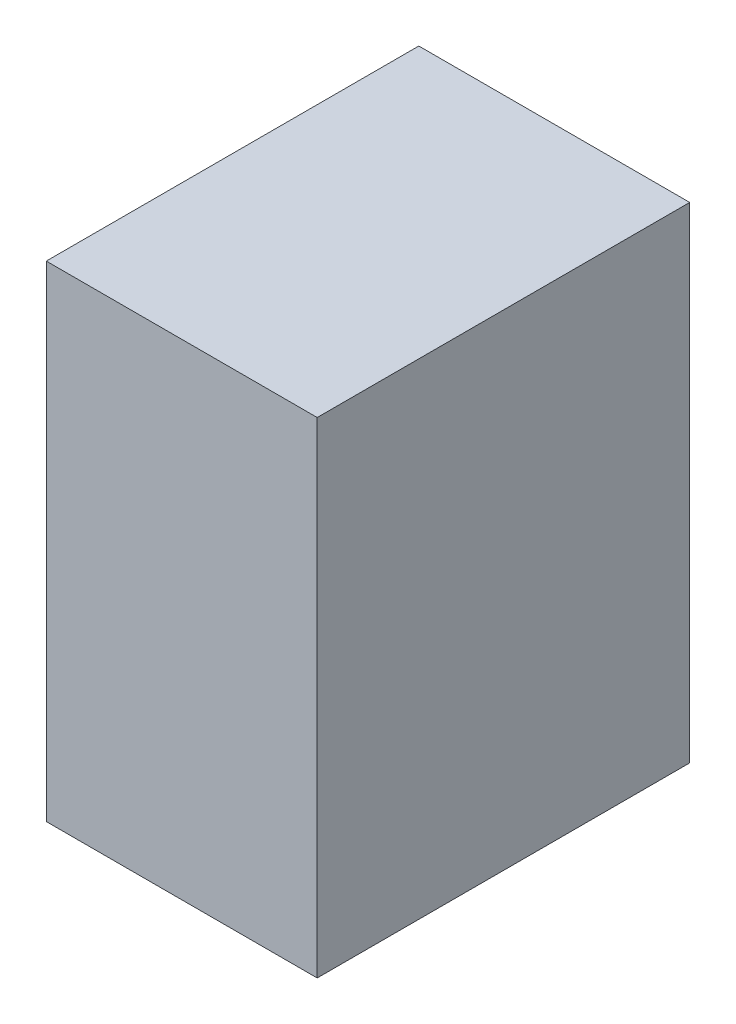
ISO-10303-21;
HEADER;
FILE_DESCRIPTION(('STEP AP214'),'2;1');
FILE_NAME('part.step','',(''),(''),'','','');
FILE_SCHEMA(('AUTOMOTIVE_DESIGN { 1 0 10303 214 1 1 1 1 }'));
ENDSEC;
DATA;
#1=APPLICATION_CONTEXT('core data for automotive mechanical design processes');
#2=APPLICATION_PROTOCOL_DEFINITION('international standard','automotive_design',2000,#1);
#3=PRODUCT_CONTEXT('',#1,'mechanical');
#4=PRODUCT('Part','Part','',(#3));
#5=PRODUCT_RELATED_PRODUCT_CATEGORY('part','',(#4));
#6=PRODUCT_DEFINITION_FORMATION('','',#4);
#7=PRODUCT_DEFINITION_CONTEXT('part definition',#1,'design');
#8=PRODUCT_DEFINITION('design','',#6,#7);
#9=PRODUCT_DEFINITION_SHAPE('','',#8);
#10=(LENGTH_UNIT() NAMED_UNIT(*) SI_UNIT(.MILLI.,.METRE.));
#11=(NAMED_UNIT(*) PLANE_ANGLE_UNIT() SI_UNIT($,.RADIAN.));
#12=(NAMED_UNIT(*) SI_UNIT($,.STERADIAN.) SOLID_ANGLE_UNIT());
#13=UNCERTAINTY_MEASURE_WITH_UNIT(LENGTH_MEASURE(1.E-05),#10,'distance_accuracy_value','');
#14=(GEOMETRIC_REPRESENTATION_CONTEXT(3) GLOBAL_UNCERTAINTY_ASSIGNED_CONTEXT((#13)) GLOBAL_UNIT_ASSIGNED_CONTEXT((#10,
#11,#12)) REPRESENTATION_CONTEXT('',''));
#15=CARTESIAN_POINT('',(0.,0.,0.));
#16=DIRECTION('',(0.,0.,1.));
#17=DIRECTION('',(1.,0.,0.));
#18=AXIS2_PLACEMENT_3D('',#15,#16,#17);
#19=CARTESIAN_POINT('',(-24.,-41.5,78.5));
#20=DIRECTION('',(0.,-1.,0.));
#21=DIRECTION('',(0.,0.,-1.));
#22=AXIS2_PLACEMENT_3D('',#19,#20,#21);
#23=PLANE('',#22);
#24=DIRECTION('',(0.,0.,-1.));
#25=VECTOR('',#24,1.);
#26=CARTESIAN_POINT('',(0.,-41.5,78.5));
#27=LINE('',#26,#25);
#28=CARTESIAN_POINT('',(0.,-41.5,78.5));
#29=VERTEX_POINT('',#28);
#30=CARTESIAN_POINT('',(0.,-41.5,45.5));
#31=VERTEX_POINT('',#30);
#32=EDGE_CURVE('E104',#29,#31,#27,.T.);
#33=ORIENTED_EDGE('',*,*,#32,.F.);
#34=DIRECTION('',(1.,0.,0.));
#35=VECTOR('',#34,1.);
#36=CARTESIAN_POINT('',(-24.,-41.5,78.5));
#37=LINE('',#36,#35);
#38=CARTESIAN_POINT('',(-24.,-41.5,78.5));
#39=VERTEX_POINT('',#38);
#40=EDGE_CURVE('E11',#39,#29,#37,.T.);
#41=ORIENTED_EDGE('',*,*,#40,.F.);
#42=DIRECTION('',(0.,0.,-1.));
#43=VECTOR('',#42,1.);
#44=CARTESIAN_POINT('',(-24.,-41.5,78.5));
#45=LINE('',#44,#43);
#46=CARTESIAN_POINT('',(-24.,-41.5,45.5));
#47=VERTEX_POINT('',#46);
#48=EDGE_CURVE('E97',#39,#47,#45,.T.);
#49=ORIENTED_EDGE('',*,*,#48,.T.);
#50=DIRECTION('',(1.,0.,0.));
#51=VECTOR('',#50,1.);
#52=CARTESIAN_POINT('',(-24.,-41.5,45.5));
#53=LINE('',#52,#51);
#54=EDGE_CURVE('E42',#47,#31,#53,.T.);
#55=ORIENTED_EDGE('',*,*,#54,.T.);
#56=EDGE_LOOP('',(#33,#41,#49,#55));
#57=FACE_BOUND('',#56,.T.);
#58=ADVANCED_FACE('F41',(#57),#23,.T.);
#59=CARTESIAN_POINT('',(-24.,1.5,78.5));
#60=DIRECTION('',(0.,0.,1.));
#61=DIRECTION('',(1.,0.,0.));
#62=AXIS2_PLACEMENT_3D('',#59,#60,#61);
#63=PLANE('',#62);
#64=DIRECTION('',(0.,-1.,0.));
#65=VECTOR('',#64,1.);
#66=CARTESIAN_POINT('',(0.,1.5,78.5));
#67=LINE('',#66,#65);
#68=CARTESIAN_POINT('',(0.,1.5,78.5));
#69=VERTEX_POINT('',#68);
#70=EDGE_CURVE('E101',#69,#29,#67,.T.);
#71=ORIENTED_EDGE('',*,*,#70,.F.);
#72=DIRECTION('',(1.,0.,0.));
#73=VECTOR('',#72,1.);
#74=CARTESIAN_POINT('',(-24.,1.5,78.5));
#75=LINE('',#74,#73);
#76=CARTESIAN_POINT('',(-24.,1.5,78.5));
#77=VERTEX_POINT('',#76);
#78=EDGE_CURVE('E49',#77,#69,#75,.T.);
#79=ORIENTED_EDGE('',*,*,#78,.F.);
#80=DIRECTION('',(0.,-1.,0.));
#81=VECTOR('',#80,1.);
#82=CARTESIAN_POINT('',(-24.,1.5,78.5));
#83=LINE('',#82,#81);
#84=EDGE_CURVE('E96',#77,#39,#83,.T.);
#85=ORIENTED_EDGE('',*,*,#84,.T.);
#86=ORIENTED_EDGE('',*,*,#40,.T.);
#87=EDGE_LOOP('',(#71,#79,#85,#86));
#88=FACE_BOUND('',#87,.T.);
#89=ADVANCED_FACE('F113',(#88),#63,.T.);
#90=CARTESIAN_POINT('',(-24.,1.5,45.5));
#91=DIRECTION('',(0.,1.,0.));
#92=DIRECTION('',(0.,0.,1.));
#93=AXIS2_PLACEMENT_3D('',#90,#91,#92);
#94=PLANE('',#93);
#95=DIRECTION('',(0.,0.,1.));
#96=VECTOR('',#95,1.);
#97=CARTESIAN_POINT('',(0.,1.5,45.5));
#98=LINE('',#97,#96);
#99=CARTESIAN_POINT('',(0.,1.5,45.5));
#100=VERTEX_POINT('',#99);
#101=EDGE_CURVE('E93',#100,#69,#98,.T.);
#102=ORIENTED_EDGE('',*,*,#101,.F.);
#103=DIRECTION('',(1.,0.,0.));
#104=VECTOR('',#103,1.);
#105=CARTESIAN_POINT('',(-24.,1.5,45.5));
#106=LINE('',#105,#104);
#107=CARTESIAN_POINT('',(-24.,1.5,45.5));
#108=VERTEX_POINT('',#107);
#109=EDGE_CURVE('E88',#108,#100,#106,.T.);
#110=ORIENTED_EDGE('',*,*,#109,.F.);
#111=DIRECTION('',(0.,0.,1.));
#112=VECTOR('',#111,1.);
#113=CARTESIAN_POINT('',(-24.,1.5,45.5));
#114=LINE('',#113,#112);
#115=EDGE_CURVE('E90',#108,#77,#114,.T.);
#116=ORIENTED_EDGE('',*,*,#115,.T.);
#117=ORIENTED_EDGE('',*,*,#78,.T.);
#118=EDGE_LOOP('',(#102,#110,#116,#117));
#119=FACE_BOUND('',#118,.T.);
#120=ADVANCED_FACE('F86',(#119),#94,.T.);
#121=CARTESIAN_POINT('',(-24.,-41.5,45.5));
#122=DIRECTION('',(0.,0.,-1.));
#123=DIRECTION('',(-1.,0.,0.));
#124=AXIS2_PLACEMENT_3D('',#121,#122,#123);
#125=PLANE('',#124);
#126=DIRECTION('',(0.,1.,0.));
#127=VECTOR('',#126,1.);
#128=CARTESIAN_POINT('',(0.,-41.5,45.5));
#129=LINE('',#128,#127);
#130=EDGE_CURVE('E107',#31,#100,#129,.T.);
#131=ORIENTED_EDGE('',*,*,#130,.F.);
#132=ORIENTED_EDGE('',*,*,#54,.F.);
#133=DIRECTION('',(0.,1.,0.));
#134=VECTOR('',#133,1.);
#135=CARTESIAN_POINT('',(-24.,-41.5,45.5));
#136=LINE('',#135,#134);
#137=EDGE_CURVE('E92',#47,#108,#136,.T.);
#138=ORIENTED_EDGE('',*,*,#137,.T.);
#139=ORIENTED_EDGE('',*,*,#109,.T.);
#140=EDGE_LOOP('',(#131,#132,#138,#139));
#141=FACE_BOUND('',#140,.T.);
#142=ADVANCED_FACE('F98',(#141),#125,.T.);
#143=CARTESIAN_POINT('',(-24.,0.,0.));
#144=DIRECTION('',(1.,0.,0.));
#145=DIRECTION('',(0.,0.,-1.));
#146=AXIS2_PLACEMENT_3D('',#143,#144,#145);
#147=PLANE('',#146);
#148=ORIENTED_EDGE('',*,*,#48,.F.);
#149=ORIENTED_EDGE('',*,*,#84,.F.);
#150=ORIENTED_EDGE('',*,*,#115,.F.);
#151=ORIENTED_EDGE('',*,*,#137,.F.);
#152=EDGE_LOOP('',(#148,#149,#150,#151));
#153=FACE_BOUND('',#152,.T.);
#154=ADVANCED_FACE('F94',(#153),#147,.F.);
#155=CARTESIAN_POINT('',(0.,0.,0.));
#156=DIRECTION('',(1.,0.,0.));
#157=DIRECTION('',(0.,0.,-1.));
#158=AXIS2_PLACEMENT_3D('',#155,#156,#157);
#159=PLANE('',#158);
#160=ORIENTED_EDGE('',*,*,#32,.T.);
#161=ORIENTED_EDGE('',*,*,#130,.T.);
#162=ORIENTED_EDGE('',*,*,#101,.T.);
#163=ORIENTED_EDGE('',*,*,#70,.T.);
#164=EDGE_LOOP('',(#160,#161,#162,#163));
#165=FACE_BOUND('',#164,.T.);
#166=ADVANCED_FACE('F111',(#165),#159,.T.);
#167=CLOSED_SHELL('',(#58,#89,#120,#142,#154,#166));
#168=MANIFOLD_SOLID_BREP('B2',#167);
#169=ADVANCED_BREP_SHAPE_REPRESENTATION('',(#18,#168),#14);
#170=SHAPE_DEFINITION_REPRESENTATION(#9,#169);
ENDSEC;
END-ISO-10303-21;
